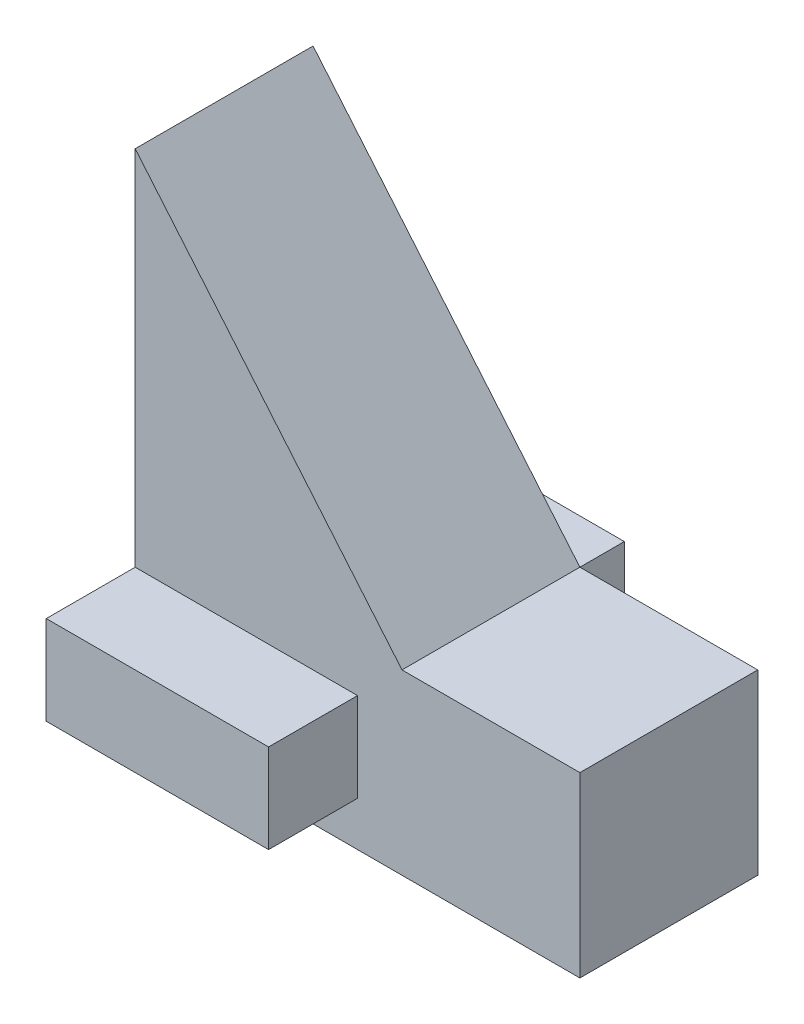
ISO-10303-21;
HEADER;
FILE_DESCRIPTION(('STEP AP214'),'2;1');
FILE_NAME('part.step','',(''),(''),'','','');
FILE_SCHEMA(('AUTOMOTIVE_DESIGN { 1 0 10303 214 1 1 1 1 }'));
ENDSEC;
DATA;
#1=APPLICATION_CONTEXT('core data for automotive mechanical design processes');
#2=APPLICATION_PROTOCOL_DEFINITION('international standard','automotive_design',2000,#1);
#3=PRODUCT_CONTEXT('',#1,'mechanical');
#4=PRODUCT('Part','Part','',(#3));
#5=PRODUCT_RELATED_PRODUCT_CATEGORY('part','',(#4));
#6=PRODUCT_DEFINITION_FORMATION('','',#4);
#7=PRODUCT_DEFINITION_CONTEXT('part definition',#1,'design');
#8=PRODUCT_DEFINITION('design','',#6,#7);
#9=PRODUCT_DEFINITION_SHAPE('','',#8);
#10=(LENGTH_UNIT() NAMED_UNIT(*) SI_UNIT(.MILLI.,.METRE.));
#11=(NAMED_UNIT(*) PLANE_ANGLE_UNIT() SI_UNIT($,.RADIAN.));
#12=(NAMED_UNIT(*) SI_UNIT($,.STERADIAN.) SOLID_ANGLE_UNIT());
#13=UNCERTAINTY_MEASURE_WITH_UNIT(LENGTH_MEASURE(1.E-05),#10,'distance_accuracy_value','');
#14=(GEOMETRIC_REPRESENTATION_CONTEXT(3) GLOBAL_UNCERTAINTY_ASSIGNED_CONTEXT((#13)) GLOBAL_UNIT_ASSIGNED_CONTEXT((#10,
#11,#12)) REPRESENTATION_CONTEXT('',''));
#15=CARTESIAN_POINT('',(0.,0.,0.));
#16=DIRECTION('',(0.,0.,1.));
#17=DIRECTION('',(1.,0.,0.));
#18=AXIS2_PLACEMENT_3D('',#15,#16,#17);
#19=CARTESIAN_POINT('',(15.6103528613926,4.15951571790276,4.));
#20=DIRECTION('',(-0.766044443118982,-0.642787609686535,0.));
#21=DIRECTION('',(0.642787609686535,-0.766044443118982,0.));
#22=AXIS2_PLACEMENT_3D('',#19,#20,#21);
#23=PLANE('',#22);
#24=DIRECTION('',(-0.642787609686535,0.766044443118982,0.));
#25=VECTOR('',#24,1.);
#26=CARTESIAN_POINT('',(15.6103528613926,4.15951571790276,0.));
#27=LINE('',#26,#25);
#28=CARTESIAN_POINT('',(21.6103528613926,-2.99100583766258,0.));
#29=VERTEX_POINT('',#28);
#30=CARTESIAN_POINT('',(15.6103528613926,4.15951571790276,0.));
#31=VERTEX_POINT('',#30);
#32=EDGE_CURVE('E195',#29,#31,#27,.T.);
#33=ORIENTED_EDGE('',*,*,#32,.T.);
#34=DIRECTION('',(0.,0.,-1.));
#35=VECTOR('',#34,1.);
#36=CARTESIAN_POINT('',(15.6103528613926,4.15951571790276,4.));
#37=LINE('',#36,#35);
#38=CARTESIAN_POINT('',(15.6103528613926,4.15951571790276,4.));
#39=VERTEX_POINT('',#38);
#40=EDGE_CURVE('E11',#39,#31,#37,.T.);
#41=ORIENTED_EDGE('',*,*,#40,.F.);
#42=DIRECTION('',(-0.642787609686535,0.766044443118982,0.));
#43=VECTOR('',#42,1.);
#44=CARTESIAN_POINT('',(15.6103528613926,4.15951571790276,4.));
#45=LINE('',#44,#43);
#46=CARTESIAN_POINT('',(21.6103528613926,-2.99100583766258,4.));
#47=VERTEX_POINT('',#46);
#48=EDGE_CURVE('E196',#47,#39,#45,.T.);
#49=ORIENTED_EDGE('',*,*,#48,.F.);
#50=DIRECTION('',(0.,0.,-1.));
#51=VECTOR('',#50,1.);
#52=CARTESIAN_POINT('',(21.6103528613926,-2.99100583766258,4.));
#53=LINE('',#52,#51);
#54=EDGE_CURVE('E209',#47,#29,#53,.T.);
#55=ORIENTED_EDGE('',*,*,#54,.T.);
#56=EDGE_LOOP('',(#33,#41,#49,#55));
#57=FACE_BOUND('',#56,.T.);
#58=ADVANCED_FACE('F39',(#57),#23,.F.);
#59=CARTESIAN_POINT('',(15.6103528613926,-6.99100583766258,4.));
#60=DIRECTION('',(1.,0.,0.));
#61=DIRECTION('',(0.,0.,-1.));
#62=AXIS2_PLACEMENT_3D('',#59,#60,#61);
#63=PLANE('',#62);
#64=DIRECTION('',(0.,-1.,0.));
#65=VECTOR('',#64,1.);
#66=CARTESIAN_POINT('',(15.6103528613926,-6.99100583766258,0.));
#67=LINE('',#66,#65);
#68=CARTESIAN_POINT('',(15.6103528613926,-3.99100583766258,0.));
#69=VERTEX_POINT('',#68);
#70=EDGE_CURVE('E213',#31,#69,#67,.T.);
#71=ORIENTED_EDGE('',*,*,#70,.T.);
#72=DIRECTION('',(0.,0.,1.));
#73=VECTOR('',#72,1.);
#74=CARTESIAN_POINT('',(15.6103528613926,-3.99100583766258,-2.));
#75=LINE('',#74,#73);
#76=CARTESIAN_POINT('',(15.6103528613926,-3.99100583766258,-2.));
#77=VERTEX_POINT('',#76);
#78=EDGE_CURVE('E165',#77,#69,#75,.T.);
#79=ORIENTED_EDGE('',*,*,#78,.F.);
#80=DIRECTION('',(0.,-1.,0.));
#81=VECTOR('',#80,1.);
#82=CARTESIAN_POINT('',(15.6103528613926,-3.99100583766258,-2.));
#83=LINE('',#82,#81);
#84=CARTESIAN_POINT('',(15.6103528613926,-5.99100583766258,-2.));
#85=VERTEX_POINT('',#84);
#86=EDGE_CURVE('E153',#77,#85,#83,.T.);
#87=ORIENTED_EDGE('',*,*,#86,.T.);
#88=DIRECTION('',(0.,0.,1.));
#89=VECTOR('',#88,1.);
#90=CARTESIAN_POINT('',(15.6103528613926,-5.99100583766258,-2.));
#91=LINE('',#90,#89);
#92=CARTESIAN_POINT('',(15.6103528613926,-5.99100583766258,0.));
#93=VERTEX_POINT('',#92);
#94=EDGE_CURVE('E140',#85,#93,#91,.T.);
#95=ORIENTED_EDGE('',*,*,#94,.T.);
#96=CARTESIAN_POINT('',(15.6103528613926,-6.99100583766258,0.));
#97=VERTEX_POINT('',#96);
#98=EDGE_CURVE('E212',#93,#97,#67,.T.);
#99=ORIENTED_EDGE('',*,*,#98,.T.);
#100=DIRECTION('',(0.,0.,-1.));
#101=VECTOR('',#100,1.);
#102=CARTESIAN_POINT('',(15.6103528613926,-6.99100583766258,4.));
#103=LINE('',#102,#101);
#104=CARTESIAN_POINT('',(15.6103528613926,-6.99100583766258,4.));
#105=VERTEX_POINT('',#104);
#106=EDGE_CURVE('E46',#105,#97,#103,.T.);
#107=ORIENTED_EDGE('',*,*,#106,.F.);
#108=DIRECTION('',(0.,-1.,0.));
#109=VECTOR('',#108,1.);
#110=CARTESIAN_POINT('',(15.6103528613926,-6.99100583766258,4.));
#111=LINE('',#110,#109);
#112=CARTESIAN_POINT('',(15.6103528613926,-5.99100583766258,4.));
#113=VERTEX_POINT('',#112);
#114=EDGE_CURVE('E199',#113,#105,#111,.T.);
#115=ORIENTED_EDGE('',*,*,#114,.F.);
#116=DIRECTION('',(0.,0.,-1.));
#117=VECTOR('',#116,1.);
#118=CARTESIAN_POINT('',(15.6103528613926,-5.99100583766258,6.));
#119=LINE('',#118,#117);
#120=CARTESIAN_POINT('',(15.6103528613926,-5.99100583766258,6.));
#121=VERTEX_POINT('',#120);
#122=EDGE_CURVE('E186',#121,#113,#119,.T.);
#123=ORIENTED_EDGE('',*,*,#122,.F.);
#124=DIRECTION('',(0.,-1.,0.));
#125=VECTOR('',#124,1.);
#126=CARTESIAN_POINT('',(15.6103528613926,-3.99100583766258,6.));
#127=LINE('',#126,#125);
#128=CARTESIAN_POINT('',(15.6103528613926,-3.99100583766258,6.));
#129=VERTEX_POINT('',#128);
#130=EDGE_CURVE('E174',#129,#121,#127,.T.);
#131=ORIENTED_EDGE('',*,*,#130,.F.);
#132=DIRECTION('',(0.,0.,-1.));
#133=VECTOR('',#132,1.);
#134=CARTESIAN_POINT('',(15.6103528613926,-3.99100583766258,6.));
#135=LINE('',#134,#133);
#136=CARTESIAN_POINT('',(15.6103528613926,-3.99100583766258,4.));
#137=VERTEX_POINT('',#136);
#138=EDGE_CURVE('E189',#129,#137,#135,.T.);
#139=ORIENTED_EDGE('',*,*,#138,.T.);
#140=EDGE_CURVE('E201',#39,#137,#111,.T.);
#141=ORIENTED_EDGE('',*,*,#140,.F.);
#142=ORIENTED_EDGE('',*,*,#40,.T.);
#143=EDGE_LOOP('',(#71,#79,#87,#95,#99,#107,#115,#123,#131,#139,#141,#142));
#144=FACE_BOUND('',#143,.T.);
#145=ADVANCED_FACE('F255',(#144),#63,.F.);
#146=CARTESIAN_POINT('',(25.6103528613926,-6.99100583766258,4.));
#147=DIRECTION('',(0.,1.,0.));
#148=DIRECTION('',(-1.,0.,0.));
#149=AXIS2_PLACEMENT_3D('',#146,#147,#148);
#150=PLANE('',#149);
#151=DIRECTION('',(1.,0.,0.));
#152=VECTOR('',#151,1.);
#153=CARTESIAN_POINT('',(25.6103528613926,-6.99100583766258,0.));
#154=LINE('',#153,#152);
#155=CARTESIAN_POINT('',(25.6103528613926,-6.99100583766258,0.));
#156=VERTEX_POINT('',#155);
#157=EDGE_CURVE('E216',#97,#156,#154,.T.);
#158=ORIENTED_EDGE('',*,*,#157,.T.);
#159=DIRECTION('',(0.,0.,-1.));
#160=VECTOR('',#159,1.);
#161=CARTESIAN_POINT('',(25.6103528613926,-6.99100583766258,4.));
#162=LINE('',#161,#160);
#163=CARTESIAN_POINT('',(25.6103528613926,-6.99100583766258,4.));
#164=VERTEX_POINT('',#163);
#165=EDGE_CURVE('E226',#164,#156,#162,.T.);
#166=ORIENTED_EDGE('',*,*,#165,.F.);
#167=DIRECTION('',(1.,0.,0.));
#168=VECTOR('',#167,1.);
#169=CARTESIAN_POINT('',(25.6103528613926,-6.99100583766258,4.));
#170=LINE('',#169,#168);
#171=EDGE_CURVE('E203',#105,#164,#170,.T.);
#172=ORIENTED_EDGE('',*,*,#171,.F.);
#173=ORIENTED_EDGE('',*,*,#106,.T.);
#174=EDGE_LOOP('',(#158,#166,#172,#173));
#175=FACE_BOUND('',#174,.T.);
#176=ADVANCED_FACE('F233',(#175),#150,.F.);
#177=CARTESIAN_POINT('',(25.6103528613926,-2.99100583766258,4.));
#178=DIRECTION('',(-1.,0.,0.));
#179=DIRECTION('',(0.,0.,1.));
#180=AXIS2_PLACEMENT_3D('',#177,#178,#179);
#181=PLANE('',#180);
#182=DIRECTION('',(0.,1.,0.));
#183=VECTOR('',#182,1.);
#184=CARTESIAN_POINT('',(25.6103528613926,-2.99100583766258,0.));
#185=LINE('',#184,#183);
#186=CARTESIAN_POINT('',(25.6103528613926,-2.99100583766258,0.));
#187=VERTEX_POINT('',#186);
#188=EDGE_CURVE('E218',#156,#187,#185,.T.);
#189=ORIENTED_EDGE('',*,*,#188,.T.);
#190=DIRECTION('',(0.,0.,-1.));
#191=VECTOR('',#190,1.);
#192=CARTESIAN_POINT('',(25.6103528613926,-2.99100583766258,4.));
#193=LINE('',#192,#191);
#194=CARTESIAN_POINT('',(25.6103528613926,-2.99100583766258,4.));
#195=VERTEX_POINT('',#194);
#196=EDGE_CURVE('E223',#195,#187,#193,.T.);
#197=ORIENTED_EDGE('',*,*,#196,.F.);
#198=DIRECTION('',(0.,1.,0.));
#199=VECTOR('',#198,1.);
#200=CARTESIAN_POINT('',(25.6103528613926,-2.99100583766258,4.));
#201=LINE('',#200,#199);
#202=EDGE_CURVE('E205',#164,#195,#201,.T.);
#203=ORIENTED_EDGE('',*,*,#202,.F.);
#204=ORIENTED_EDGE('',*,*,#165,.T.);
#205=EDGE_LOOP('',(#189,#197,#203,#204));
#206=FACE_BOUND('',#205,.T.);
#207=ADVANCED_FACE('F245',(#206),#181,.F.);
#208=CARTESIAN_POINT('',(21.6103528613926,-2.99100583766258,4.));
#209=DIRECTION('',(0.,-1.,0.));
#210=DIRECTION('',(0.,0.,-1.));
#211=AXIS2_PLACEMENT_3D('',#208,#209,#210);
#212=PLANE('',#211);
#213=DIRECTION('',(-1.,0.,0.));
#214=VECTOR('',#213,1.);
#215=CARTESIAN_POINT('',(21.6103528613926,-2.99100583766258,0.));
#216=LINE('',#215,#214);
#217=EDGE_CURVE('E200',#187,#29,#216,.T.);
#218=ORIENTED_EDGE('',*,*,#217,.T.);
#219=ORIENTED_EDGE('',*,*,#54,.F.);
#220=DIRECTION('',(-1.,0.,0.));
#221=VECTOR('',#220,1.);
#222=CARTESIAN_POINT('',(21.6103528613926,-2.99100583766258,4.));
#223=LINE('',#222,#221);
#224=EDGE_CURVE('E207',#195,#47,#223,.T.);
#225=ORIENTED_EDGE('',*,*,#224,.F.);
#226=ORIENTED_EDGE('',*,*,#196,.T.);
#227=EDGE_LOOP('',(#218,#219,#225,#226));
#228=FACE_BOUND('',#227,.T.);
#229=ADVANCED_FACE('F249',(#228),#212,.F.);
#230=CARTESIAN_POINT('',(0.,0.,4.));
#231=DIRECTION('',(0.,0.,1.));
#232=DIRECTION('',(1.,0.,0.));
#233=AXIS2_PLACEMENT_3D('',#230,#231,#232);
#234=PLANE('',#233);
#235=DIRECTION('',(1.,0.,0.));
#236=VECTOR('',#235,1.);
#237=CARTESIAN_POINT('',(15.6103528613926,-5.99100583766258,4.));
#238=LINE('',#237,#236);
#239=CARTESIAN_POINT('',(20.6103528613926,-5.99100583766258,4.));
#240=VERTEX_POINT('',#239);
#241=EDGE_CURVE('E172',#113,#240,#238,.T.);
#242=ORIENTED_EDGE('',*,*,#241,.F.);
#243=ORIENTED_EDGE('',*,*,#114,.T.);
#244=ORIENTED_EDGE('',*,*,#171,.T.);
#245=ORIENTED_EDGE('',*,*,#202,.T.);
#246=ORIENTED_EDGE('',*,*,#224,.T.);
#247=ORIENTED_EDGE('',*,*,#48,.T.);
#248=ORIENTED_EDGE('',*,*,#140,.T.);
#249=DIRECTION('',(-1.,0.,0.));
#250=VECTOR('',#249,1.);
#251=CARTESIAN_POINT('',(20.6103528613926,-3.99100583766258,4.));
#252=LINE('',#251,#250);
#253=CARTESIAN_POINT('',(20.6103528613926,-3.99100583766258,4.));
#254=VERTEX_POINT('',#253);
#255=EDGE_CURVE('E180',#254,#137,#252,.T.);
#256=ORIENTED_EDGE('',*,*,#255,.F.);
#257=DIRECTION('',(0.,1.,0.));
#258=VECTOR('',#257,1.);
#259=CARTESIAN_POINT('',(20.6103528613926,-5.99100583766258,4.));
#260=LINE('',#259,#258);
#261=EDGE_CURVE('E61',#240,#254,#260,.T.);
#262=ORIENTED_EDGE('',*,*,#261,.F.);
#263=EDGE_LOOP('',(#242,#243,#244,#245,#246,#247,#248,#256,#262));
#264=FACE_BOUND('',#263,.T.);
#265=ADVANCED_FACE('F252',(#264),#234,.T.);
#266=CARTESIAN_POINT('',(0.,0.,0.));
#267=DIRECTION('',(0.,0.,1.));
#268=DIRECTION('',(1.,0.,0.));
#269=AXIS2_PLACEMENT_3D('',#266,#267,#268);
#270=PLANE('',#269);
#271=DIRECTION('',(0.,1.,0.));
#272=VECTOR('',#271,1.);
#273=CARTESIAN_POINT('',(20.6103528613926,-5.99100583766258,0.));
#274=LINE('',#273,#272);
#275=CARTESIAN_POINT('',(20.6103528613926,-5.99100583766258,0.));
#276=VERTEX_POINT('',#275);
#277=CARTESIAN_POINT('',(20.6103528613926,-3.99100583766258,0.));
#278=VERTEX_POINT('',#277);
#279=EDGE_CURVE('E53',#276,#278,#274,.T.);
#280=ORIENTED_EDGE('',*,*,#279,.T.);
#281=DIRECTION('',(-1.,0.,0.));
#282=VECTOR('',#281,1.);
#283=CARTESIAN_POINT('',(20.6103528613926,-3.99100583766258,0.));
#284=LINE('',#283,#282);
#285=EDGE_CURVE('E150',#278,#69,#284,.T.);
#286=ORIENTED_EDGE('',*,*,#285,.T.);
#287=ORIENTED_EDGE('',*,*,#70,.F.);
#288=ORIENTED_EDGE('',*,*,#32,.F.);
#289=ORIENTED_EDGE('',*,*,#217,.F.);
#290=ORIENTED_EDGE('',*,*,#188,.F.);
#291=ORIENTED_EDGE('',*,*,#157,.F.);
#292=ORIENTED_EDGE('',*,*,#98,.F.);
#293=DIRECTION('',(1.,0.,0.));
#294=VECTOR('',#293,1.);
#295=CARTESIAN_POINT('',(15.6103528613926,-5.99100583766258,0.));
#296=LINE('',#295,#294);
#297=EDGE_CURVE('E160',#93,#276,#296,.T.);
#298=ORIENTED_EDGE('',*,*,#297,.T.);
#299=EDGE_LOOP('',(#280,#286,#287,#288,#289,#290,#291,#292,#298));
#300=FACE_BOUND('',#299,.T.);
#301=ADVANCED_FACE('F240',(#300),#270,.F.);
#302=CARTESIAN_POINT('',(20.6103528613926,-5.99100583766258,6.));
#303=DIRECTION('',(-1.,0.,0.));
#304=DIRECTION('',(0.,0.,1.));
#305=AXIS2_PLACEMENT_3D('',#302,#303,#304);
#306=PLANE('',#305);
#307=ORIENTED_EDGE('',*,*,#261,.T.);
#308=DIRECTION('',(0.,0.,-1.));
#309=VECTOR('',#308,1.);
#310=CARTESIAN_POINT('',(20.6103528613926,-3.99100583766258,6.));
#311=LINE('',#310,#309);
#312=CARTESIAN_POINT('',(20.6103528613926,-3.99100583766258,6.));
#313=VERTEX_POINT('',#312);
#314=EDGE_CURVE('E192',#313,#254,#311,.T.);
#315=ORIENTED_EDGE('',*,*,#314,.F.);
#316=DIRECTION('',(0.,1.,0.));
#317=VECTOR('',#316,1.);
#318=CARTESIAN_POINT('',(20.6103528613926,-5.99100583766258,6.));
#319=LINE('',#318,#317);
#320=CARTESIAN_POINT('',(20.6103528613926,-5.99100583766258,6.));
#321=VERTEX_POINT('',#320);
#322=EDGE_CURVE('E168',#321,#313,#319,.T.);
#323=ORIENTED_EDGE('',*,*,#322,.F.);
#324=DIRECTION('',(0.,0.,-1.));
#325=VECTOR('',#324,1.);
#326=CARTESIAN_POINT('',(20.6103528613926,-5.99100583766258,6.));
#327=LINE('',#326,#325);
#328=EDGE_CURVE('E178',#321,#240,#327,.T.);
#329=ORIENTED_EDGE('',*,*,#328,.T.);
#330=EDGE_LOOP('',(#307,#315,#323,#329));
#331=FACE_BOUND('',#330,.T.);
#332=ADVANCED_FACE('F269',(#331),#306,.F.);
#333=CARTESIAN_POINT('',(20.6103528613926,-3.99100583766258,6.));
#334=DIRECTION('',(0.,-1.,0.));
#335=DIRECTION('',(0.,0.,-1.));
#336=AXIS2_PLACEMENT_3D('',#333,#334,#335);
#337=PLANE('',#336);
#338=ORIENTED_EDGE('',*,*,#255,.T.);
#339=ORIENTED_EDGE('',*,*,#138,.F.);
#340=DIRECTION('',(-1.,0.,0.));
#341=VECTOR('',#340,1.);
#342=CARTESIAN_POINT('',(20.6103528613926,-3.99100583766258,6.));
#343=LINE('',#342,#341);
#344=EDGE_CURVE('E171',#313,#129,#343,.T.);
#345=ORIENTED_EDGE('',*,*,#344,.F.);
#346=ORIENTED_EDGE('',*,*,#314,.T.);
#347=EDGE_LOOP('',(#338,#339,#345,#346));
#348=FACE_BOUND('',#347,.T.);
#349=ADVANCED_FACE('F267',(#348),#337,.F.);
#350=CARTESIAN_POINT('',(15.6103528613926,-5.99100583766258,6.));
#351=DIRECTION('',(0.,1.,0.));
#352=DIRECTION('',(0.,0.,1.));
#353=AXIS2_PLACEMENT_3D('',#350,#351,#352);
#354=PLANE('',#353);
#355=ORIENTED_EDGE('',*,*,#241,.T.);
#356=ORIENTED_EDGE('',*,*,#328,.F.);
#357=DIRECTION('',(1.,0.,0.));
#358=VECTOR('',#357,1.);
#359=CARTESIAN_POINT('',(15.6103528613926,-5.99100583766258,6.));
#360=LINE('',#359,#358);
#361=EDGE_CURVE('E176',#121,#321,#360,.T.);
#362=ORIENTED_EDGE('',*,*,#361,.F.);
#363=ORIENTED_EDGE('',*,*,#122,.T.);
#364=EDGE_LOOP('',(#355,#356,#362,#363));
#365=FACE_BOUND('',#364,.T.);
#366=ADVANCED_FACE('F259',(#365),#354,.F.);
#367=CARTESIAN_POINT('',(0.,0.,6.));
#368=DIRECTION('',(0.,0.,1.));
#369=DIRECTION('',(1.,0.,0.));
#370=AXIS2_PLACEMENT_3D('',#367,#368,#369);
#371=PLANE('',#370);
#372=ORIENTED_EDGE('',*,*,#322,.T.);
#373=ORIENTED_EDGE('',*,*,#344,.T.);
#374=ORIENTED_EDGE('',*,*,#130,.T.);
#375=ORIENTED_EDGE('',*,*,#361,.T.);
#376=EDGE_LOOP('',(#372,#373,#374,#375));
#377=FACE_BOUND('',#376,.T.);
#378=ADVANCED_FACE('F263',(#377),#371,.T.);
#379=CARTESIAN_POINT('',(20.6103528613926,-5.99100583766258,-2.));
#380=DIRECTION('',(1.,0.,0.));
#381=DIRECTION('',(0.,0.,-1.));
#382=AXIS2_PLACEMENT_3D('',#379,#380,#381);
#383=PLANE('',#382);
#384=ORIENTED_EDGE('',*,*,#279,.F.);
#385=DIRECTION('',(0.,0.,1.));
#386=VECTOR('',#385,1.);
#387=CARTESIAN_POINT('',(20.6103528613926,-5.99100583766258,-2.));
#388=LINE('',#387,#386);
#389=CARTESIAN_POINT('',(20.6103528613926,-5.99100583766258,-2.));
#390=VERTEX_POINT('',#389);
#391=EDGE_CURVE('E131',#390,#276,#388,.T.);
#392=ORIENTED_EDGE('',*,*,#391,.F.);
#393=DIRECTION('',(0.,1.,0.));
#394=VECTOR('',#393,1.);
#395=CARTESIAN_POINT('',(20.6103528613926,-5.99100583766258,-2.));
#396=LINE('',#395,#394);
#397=CARTESIAN_POINT('',(20.6103528613926,-3.99100583766258,-2.));
#398=VERTEX_POINT('',#397);
#399=EDGE_CURVE('E134',#390,#398,#396,.T.);
#400=ORIENTED_EDGE('',*,*,#399,.T.);
#401=DIRECTION('',(0.,0.,1.));
#402=VECTOR('',#401,1.);
#403=CARTESIAN_POINT('',(20.6103528613926,-3.99100583766258,-2.));
#404=LINE('',#403,#402);
#405=EDGE_CURVE('E158',#398,#278,#404,.T.);
#406=ORIENTED_EDGE('',*,*,#405,.T.);
#407=EDGE_LOOP('',(#384,#392,#400,#406));
#408=FACE_BOUND('',#407,.T.);
#409=ADVANCED_FACE('F133',(#408),#383,.T.);
#410=CARTESIAN_POINT('',(15.6103528613926,-5.99100583766258,-2.));
#411=DIRECTION('',(0.,-1.,0.));
#412=DIRECTION('',(0.,0.,-1.));
#413=AXIS2_PLACEMENT_3D('',#410,#411,#412);
#414=PLANE('',#413);
#415=ORIENTED_EDGE('',*,*,#297,.F.);
#416=ORIENTED_EDGE('',*,*,#94,.F.);
#417=DIRECTION('',(1.,0.,0.));
#418=VECTOR('',#417,1.);
#419=CARTESIAN_POINT('',(15.6103528613926,-5.99100583766258,-2.));
#420=LINE('',#419,#418);
#421=EDGE_CURVE('E146',#85,#390,#420,.T.);
#422=ORIENTED_EDGE('',*,*,#421,.T.);
#423=ORIENTED_EDGE('',*,*,#391,.T.);
#424=EDGE_LOOP('',(#415,#416,#422,#423));
#425=FACE_BOUND('',#424,.T.);
#426=ADVANCED_FACE('F152',(#425),#414,.T.);
#427=CARTESIAN_POINT('',(20.6103528613926,-3.99100583766258,-2.));
#428=DIRECTION('',(0.,1.,0.));
#429=DIRECTION('',(0.,0.,1.));
#430=AXIS2_PLACEMENT_3D('',#427,#428,#429);
#431=PLANE('',#430);
#432=ORIENTED_EDGE('',*,*,#285,.F.);
#433=ORIENTED_EDGE('',*,*,#405,.F.);
#434=DIRECTION('',(-1.,0.,0.));
#435=VECTOR('',#434,1.);
#436=CARTESIAN_POINT('',(20.6103528613926,-3.99100583766258,-2.));
#437=LINE('',#436,#435);
#438=EDGE_CURVE('E149',#398,#77,#437,.T.);
#439=ORIENTED_EDGE('',*,*,#438,.T.);
#440=ORIENTED_EDGE('',*,*,#78,.T.);
#441=EDGE_LOOP('',(#432,#433,#439,#440));
#442=FACE_BOUND('',#441,.T.);
#443=ADVANCED_FACE('F288',(#442),#431,.T.);
#444=CARTESIAN_POINT('',(0.,0.,-2.));
#445=DIRECTION('',(0.,0.,-1.));
#446=DIRECTION('',(1.,0.,0.));
#447=AXIS2_PLACEMENT_3D('',#444,#445,#446);
#448=PLANE('',#447);
#449=ORIENTED_EDGE('',*,*,#399,.F.);
#450=ORIENTED_EDGE('',*,*,#421,.F.);
#451=ORIENTED_EDGE('',*,*,#86,.F.);
#452=ORIENTED_EDGE('',*,*,#438,.F.);
#453=EDGE_LOOP('',(#449,#450,#451,#452));
#454=FACE_BOUND('',#453,.T.);
#455=ADVANCED_FACE('F144',(#454),#448,.T.);
#456=CLOSED_SHELL('',(#58,#145,#176,#207,#229,#265,#301,#332,#349,#366,#378,#409,#426,#443,#455));
#457=MANIFOLD_SOLID_BREP('B2',#456);
#458=ADVANCED_BREP_SHAPE_REPRESENTATION('',(#18,#457),#14);
#459=SHAPE_DEFINITION_REPRESENTATION(#9,#458);
ENDSEC;
END-ISO-10303-21;
